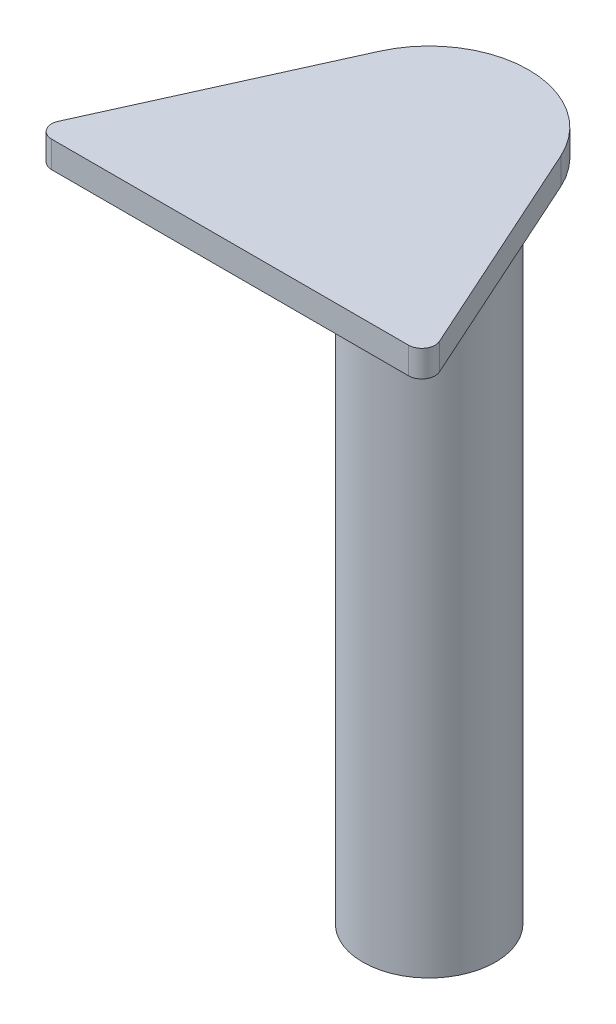
ISO-10303-21;
HEADER;
FILE_DESCRIPTION(('STEP AP214'),'2;1');
FILE_NAME('part.step','',(''),(''),'','','');
FILE_SCHEMA(('AUTOMOTIVE_DESIGN { 1 0 10303 214 1 1 1 1 }'));
ENDSEC;
DATA;
#1=APPLICATION_CONTEXT('core data for automotive mechanical design processes');
#2=APPLICATION_PROTOCOL_DEFINITION('international standard','automotive_design',2000,#1);
#3=PRODUCT_CONTEXT('',#1,'mechanical');
#4=PRODUCT('Part','Part','',(#3));
#5=PRODUCT_RELATED_PRODUCT_CATEGORY('part','',(#4));
#6=PRODUCT_DEFINITION_FORMATION('','',#4);
#7=PRODUCT_DEFINITION_CONTEXT('part definition',#1,'design');
#8=PRODUCT_DEFINITION('design','',#6,#7);
#9=PRODUCT_DEFINITION_SHAPE('','',#8);
#10=(LENGTH_UNIT() NAMED_UNIT(*) SI_UNIT(.MILLI.,.METRE.));
#11=(NAMED_UNIT(*) PLANE_ANGLE_UNIT() SI_UNIT($,.RADIAN.));
#12=(NAMED_UNIT(*) SI_UNIT($,.STERADIAN.) SOLID_ANGLE_UNIT());
#13=UNCERTAINTY_MEASURE_WITH_UNIT(LENGTH_MEASURE(1.E-05),#10,'distance_accuracy_value','');
#14=(GEOMETRIC_REPRESENTATION_CONTEXT(3) GLOBAL_UNCERTAINTY_ASSIGNED_CONTEXT((#13)) GLOBAL_UNIT_ASSIGNED_CONTEXT((#10,
#11,#12)) REPRESENTATION_CONTEXT('',''));
#15=CARTESIAN_POINT('',(0.,0.,0.));
#16=DIRECTION('',(0.,0.,1.));
#17=DIRECTION('',(1.,0.,0.));
#18=AXIS2_PLACEMENT_3D('',#15,#16,#17);
#19=CARTESIAN_POINT('',(0.,50.,0.));
#20=DIRECTION('',(0.,-1.,0.));
#21=DIRECTION('',(0.,0.,-1.));
#22=AXIS2_PLACEMENT_3D('',#19,#20,#21);
#23=CYLINDRICAL_SURFACE('',#22,5.);
#24=CARTESIAN_POINT('',(0.,50.,0.));
#25=DIRECTION('',(0.,1.,0.));
#26=DIRECTION('',(0.,0.,1.));
#27=AXIS2_PLACEMENT_3D('',#24,#25,#26);
#28=CIRCLE('',#27,5.);
#29=CARTESIAN_POINT('',(0.,50.,5.));
#30=VERTEX_POINT('',#29);
#31=EDGE_CURVE('E11',#30,#30,#28,.T.);
#32=ORIENTED_EDGE('',*,*,#31,.F.);
#33=EDGE_LOOP('',(#32));
#34=FACE_BOUND('',#33,.T.);
#35=CARTESIAN_POINT('',(0.,0.,0.));
#36=DIRECTION('',(0.,1.,0.));
#37=DIRECTION('',(0.,0.,1.));
#38=AXIS2_PLACEMENT_3D('',#35,#36,#37);
#39=CIRCLE('',#38,5.);
#40=CARTESIAN_POINT('',(0.,0.,5.));
#41=VERTEX_POINT('',#40);
#42=EDGE_CURVE('E48',#41,#41,#39,.T.);
#43=ORIENTED_EDGE('',*,*,#42,.T.);
#44=EDGE_LOOP('',(#43));
#45=FACE_BOUND('',#44,.T.);
#46=ADVANCED_FACE('F44',(#34,#45),#23,.T.);
#47=CARTESIAN_POINT('',(0.,0.,0.));
#48=DIRECTION('',(0.,1.,0.));
#49=DIRECTION('',(0.,0.,1.));
#50=AXIS2_PLACEMENT_3D('',#47,#48,#49);
#51=PLANE('',#50);
#52=ORIENTED_EDGE('',*,*,#42,.F.);
#53=EDGE_LOOP('',(#52));
#54=FACE_BOUND('',#53,.T.);
#55=ADVANCED_FACE('F168',(#54),#51,.F.);
#56=CARTESIAN_POINT('',(13.4514162296451,52.,14.));
#57=DIRECTION('',(0.,-1.,0.));
#58=DIRECTION('',(0.,0.,-1.));
#59=AXIS2_PLACEMENT_3D('',#56,#57,#58);
#60=CYLINDRICAL_SURFACE('',#59,1.);
#61=CARTESIAN_POINT('',(13.4514162296451,50.,14.));
#62=DIRECTION('',(0.,1.,0.));
#63=DIRECTION('',(0.,0.,1.));
#64=AXIS2_PLACEMENT_3D('',#61,#62,#63);
#65=CIRCLE('',#64,1.);
#66=CARTESIAN_POINT('',(13.4514162296451,50.,15.));
#67=VERTEX_POINT('',#66);
#68=CARTESIAN_POINT('',(14.3628540574113,50.,13.5885621722338));
#69=VERTEX_POINT('',#68);
#70=EDGE_CURVE('E133',#67,#69,#65,.T.);
#71=ORIENTED_EDGE('',*,*,#70,.T.);
#72=DIRECTION('',(0.,-1.,0.));
#73=VECTOR('',#72,1.);
#74=CARTESIAN_POINT('',(14.3628540574113,52.,13.5885621722338));
#75=LINE('',#74,#73);
#76=CARTESIAN_POINT('',(14.3628540574113,52.,13.5885621722338));
#77=VERTEX_POINT('',#76);
#78=EDGE_CURVE('E165',#77,#69,#75,.T.);
#79=ORIENTED_EDGE('',*,*,#78,.F.);
#80=CARTESIAN_POINT('',(13.4514162296451,52.,14.));
#81=DIRECTION('',(0.,1.,0.));
#82=DIRECTION('',(0.,0.,1.));
#83=AXIS2_PLACEMENT_3D('',#80,#81,#82);
#84=CIRCLE('',#83,1.);
#85=CARTESIAN_POINT('',(13.4514162296451,52.,15.));
#86=VERTEX_POINT('',#85);
#87=EDGE_CURVE('E151',#86,#77,#84,.T.);
#88=ORIENTED_EDGE('',*,*,#87,.F.);
#89=DIRECTION('',(0.,-1.,0.));
#90=VECTOR('',#89,1.);
#91=CARTESIAN_POINT('',(13.4514162296451,52.,15.));
#92=LINE('',#91,#90);
#93=EDGE_CURVE('E132',#86,#67,#92,.T.);
#94=ORIENTED_EDGE('',*,*,#93,.T.);
#95=EDGE_LOOP('',(#71,#79,#88,#94));
#96=FACE_BOUND('',#95,.T.);
#97=ADVANCED_FACE('F175',(#96),#60,.T.);
#98=CARTESIAN_POINT('',(14.3628540574113,52.,13.5885621722338));
#99=DIRECTION('',(-0.911437827766148,0.,0.411437827766148));
#100=DIRECTION('',(0.411437827766148,0.,0.911437827766148));
#101=AXIS2_PLACEMENT_3D('',#98,#99,#100);
#102=PLANE('',#101);
#103=DIRECTION('',(-0.411437827766148,0.,-0.911437827766148));
#104=VECTOR('',#103,1.);
#105=CARTESIAN_POINT('',(14.3628540574113,50.,13.5885621722338));
#106=LINE('',#105,#104);
#107=CARTESIAN_POINT('',(6.83578370824611,50.,-3.08578370824611));
#108=VERTEX_POINT('',#107);
#109=EDGE_CURVE('E136',#69,#108,#106,.T.);
#110=ORIENTED_EDGE('',*,*,#109,.T.);
#111=DIRECTION('',(0.,-1.,0.));
#112=VECTOR('',#111,1.);
#113=CARTESIAN_POINT('',(6.83578370824611,52.,-3.08578370824611));
#114=LINE('',#113,#112);
#115=CARTESIAN_POINT('',(6.83578370824611,52.,-3.08578370824611));
#116=VERTEX_POINT('',#115);
#117=EDGE_CURVE('E158',#116,#108,#114,.T.);
#118=ORIENTED_EDGE('',*,*,#117,.F.);
#119=DIRECTION('',(-0.411437827766148,0.,-0.911437827766148));
#120=VECTOR('',#119,1.);
#121=CARTESIAN_POINT('',(14.3628540574113,52.,13.5885621722338));
#122=LINE('',#121,#120);
#123=EDGE_CURVE('E99',#77,#116,#122,.T.);
#124=ORIENTED_EDGE('',*,*,#123,.F.);
#125=ORIENTED_EDGE('',*,*,#78,.T.);
#126=EDGE_LOOP('',(#110,#118,#124,#125));
#127=FACE_BOUND('',#126,.T.);
#128=ADVANCED_FACE('F180',(#127),#102,.F.);
#129=CARTESIAN_POINT('',(0.,52.,0.));
#130=DIRECTION('',(0.,-1.,0.));
#131=DIRECTION('',(0.,0.,-1.));
#132=AXIS2_PLACEMENT_3D('',#129,#130,#131);
#133=CYLINDRICAL_SURFACE('',#132,7.5);
#134=CARTESIAN_POINT('',(0.,50.,0.));
#135=DIRECTION('',(0.,1.,0.));
#136=DIRECTION('',(0.,0.,1.));
#137=AXIS2_PLACEMENT_3D('',#134,#135,#136);
#138=CIRCLE('',#137,7.5);
#139=CARTESIAN_POINT('',(-6.83578370824611,50.,-3.08578370824611));
#140=VERTEX_POINT('',#139);
#141=EDGE_CURVE('E142',#108,#140,#138,.T.);
#142=ORIENTED_EDGE('',*,*,#141,.T.);
#143=DIRECTION('',(0.,-1.,0.));
#144=VECTOR('',#143,1.);
#145=CARTESIAN_POINT('',(-6.83578370824611,52.,-3.08578370824611));
#146=LINE('',#145,#144);
#147=CARTESIAN_POINT('',(-6.83578370824611,52.,-3.08578370824611));
#148=VERTEX_POINT('',#147);
#149=EDGE_CURVE('E121',#148,#140,#146,.T.);
#150=ORIENTED_EDGE('',*,*,#149,.F.);
#151=CARTESIAN_POINT('',(0.,52.,0.));
#152=DIRECTION('',(0.,1.,0.));
#153=DIRECTION('',(0.,0.,1.));
#154=AXIS2_PLACEMENT_3D('',#151,#152,#153);
#155=CIRCLE('',#154,7.5);
#156=EDGE_CURVE('E114',#116,#148,#155,.T.);
#157=ORIENTED_EDGE('',*,*,#156,.F.);
#158=ORIENTED_EDGE('',*,*,#117,.T.);
#159=EDGE_LOOP('',(#142,#150,#157,#158));
#160=FACE_BOUND('',#159,.T.);
#161=ADVANCED_FACE('F184',(#160),#133,.T.);
#162=CARTESIAN_POINT('',(-14.3628540574113,52.,13.5885621722338));
#163=DIRECTION('',(0.911437827766148,0.,0.411437827766148));
#164=DIRECTION('',(0.411437827766148,0.,-0.911437827766148));
#165=AXIS2_PLACEMENT_3D('',#162,#163,#164);
#166=PLANE('',#165);
#167=DIRECTION('',(-0.411437827766148,0.,0.911437827766148));
#168=VECTOR('',#167,1.);
#169=CARTESIAN_POINT('',(-14.3628540574113,50.,13.5885621722338));
#170=LINE('',#169,#168);
#171=CARTESIAN_POINT('',(-14.3628540574113,50.,13.5885621722338));
#172=VERTEX_POINT('',#171);
#173=EDGE_CURVE('E125',#140,#172,#170,.T.);
#174=ORIENTED_EDGE('',*,*,#173,.T.);
#175=DIRECTION('',(0.,-1.,0.));
#176=VECTOR('',#175,1.);
#177=CARTESIAN_POINT('',(-14.3628540574113,52.,13.5885621722338));
#178=LINE('',#177,#176);
#179=CARTESIAN_POINT('',(-14.3628540574113,52.,13.5885621722338));
#180=VERTEX_POINT('',#179);
#181=EDGE_CURVE('E116',#180,#172,#178,.T.);
#182=ORIENTED_EDGE('',*,*,#181,.F.);
#183=DIRECTION('',(-0.411437827766148,0.,0.911437827766148));
#184=VECTOR('',#183,1.);
#185=CARTESIAN_POINT('',(-14.3628540574113,52.,13.5885621722338));
#186=LINE('',#185,#184);
#187=EDGE_CURVE('E110',#148,#180,#186,.T.);
#188=ORIENTED_EDGE('',*,*,#187,.F.);
#189=ORIENTED_EDGE('',*,*,#149,.T.);
#190=EDGE_LOOP('',(#174,#182,#188,#189));
#191=FACE_BOUND('',#190,.T.);
#192=ADVANCED_FACE('F118',(#191),#166,.F.);
#193=CARTESIAN_POINT('',(-13.4514162296451,52.,14.));
#194=DIRECTION('',(0.,-1.,0.));
#195=DIRECTION('',(0.,0.,-1.));
#196=AXIS2_PLACEMENT_3D('',#193,#194,#195);
#197=CYLINDRICAL_SURFACE('',#196,1.);
#198=CARTESIAN_POINT('',(-13.4514162296451,50.,14.));
#199=DIRECTION('',(0.,1.,0.));
#200=DIRECTION('',(0.,0.,-1.));
#201=AXIS2_PLACEMENT_3D('',#198,#199,#200);
#202=CIRCLE('',#201,1.);
#203=CARTESIAN_POINT('',(-13.4514162296451,50.,15.));
#204=VERTEX_POINT('',#203);
#205=EDGE_CURVE('E83',#172,#204,#202,.T.);
#206=ORIENTED_EDGE('',*,*,#205,.T.);
#207=DIRECTION('',(0.,-1.,0.));
#208=VECTOR('',#207,1.);
#209=CARTESIAN_POINT('',(-13.4514162296451,52.,15.));
#210=LINE('',#209,#208);
#211=CARTESIAN_POINT('',(-13.4514162296451,52.,15.));
#212=VERTEX_POINT('',#211);
#213=EDGE_CURVE('E123',#212,#204,#210,.T.);
#214=ORIENTED_EDGE('',*,*,#213,.F.);
#215=CARTESIAN_POINT('',(-13.4514162296451,52.,14.));
#216=DIRECTION('',(0.,1.,0.));
#217=DIRECTION('',(0.,0.,-1.));
#218=AXIS2_PLACEMENT_3D('',#215,#216,#217);
#219=CIRCLE('',#218,1.);
#220=EDGE_CURVE('E112',#180,#212,#219,.T.);
#221=ORIENTED_EDGE('',*,*,#220,.F.);
#222=ORIENTED_EDGE('',*,*,#181,.T.);
#223=EDGE_LOOP('',(#206,#214,#221,#222));
#224=FACE_BOUND('',#223,.T.);
#225=ADVANCED_FACE('F130',(#224),#197,.T.);
#226=CARTESIAN_POINT('',(-13.4514162296451,52.,15.));
#227=DIRECTION('',(0.,0.,-1.));
#228=DIRECTION('',(-1.,0.,0.));
#229=AXIS2_PLACEMENT_3D('',#226,#227,#228);
#230=PLANE('',#229);
#231=DIRECTION('',(1.,0.,0.));
#232=VECTOR('',#231,1.);
#233=CARTESIAN_POINT('',(-13.4514162296451,50.,15.));
#234=LINE('',#233,#232);
#235=EDGE_CURVE('E93',#204,#67,#234,.T.);
#236=ORIENTED_EDGE('',*,*,#235,.T.);
#237=ORIENTED_EDGE('',*,*,#93,.F.);
#238=DIRECTION('',(1.,0.,0.));
#239=VECTOR('',#238,1.);
#240=CARTESIAN_POINT('',(-13.4514162296451,52.,15.));
#241=LINE('',#240,#239);
#242=EDGE_CURVE('E65',#212,#86,#241,.T.);
#243=ORIENTED_EDGE('',*,*,#242,.F.);
#244=ORIENTED_EDGE('',*,*,#213,.T.);
#245=EDGE_LOOP('',(#236,#237,#243,#244));
#246=FACE_BOUND('',#245,.T.);
#247=ADVANCED_FACE('F195',(#246),#230,.F.);
#248=CARTESIAN_POINT('',(13.4514162296451,52.,14.));
#249=DIRECTION('',(0.,1.,0.));
#250=DIRECTION('',(0.,0.,1.));
#251=AXIS2_PLACEMENT_3D('',#248,#249,#250);
#252=PLANE('',#251);
#253=ORIENTED_EDGE('',*,*,#87,.T.);
#254=ORIENTED_EDGE('',*,*,#123,.T.);
#255=ORIENTED_EDGE('',*,*,#156,.T.);
#256=ORIENTED_EDGE('',*,*,#187,.T.);
#257=ORIENTED_EDGE('',*,*,#220,.T.);
#258=ORIENTED_EDGE('',*,*,#242,.T.);
#259=EDGE_LOOP('',(#253,#254,#255,#256,#257,#258));
#260=FACE_BOUND('',#259,.T.);
#261=ADVANCED_FACE('F108',(#260),#252,.T.);
#262=CARTESIAN_POINT('',(13.4514162296451,50.,14.));
#263=DIRECTION('',(0.,1.,0.));
#264=DIRECTION('',(0.,0.,1.));
#265=AXIS2_PLACEMENT_3D('',#262,#263,#264);
#266=PLANE('',#265);
#267=ORIENTED_EDGE('',*,*,#31,.T.);
#268=EDGE_LOOP('',(#267));
#269=FACE_BOUND('',#268,.T.);
#270=ORIENTED_EDGE('',*,*,#70,.F.);
#271=ORIENTED_EDGE('',*,*,#235,.F.);
#272=ORIENTED_EDGE('',*,*,#205,.F.);
#273=ORIENTED_EDGE('',*,*,#173,.F.);
#274=ORIENTED_EDGE('',*,*,#141,.F.);
#275=ORIENTED_EDGE('',*,*,#109,.F.);
#276=EDGE_LOOP('',(#270,#271,#272,#273,#274,#275));
#277=FACE_BOUND('',#276,.T.);
#278=ADVANCED_FACE('F193',(#269,#277),#266,.F.);
#279=CLOSED_SHELL('',(#46,#55,#97,#128,#161,#192,#225,#247,#261,#278));
#280=MANIFOLD_SOLID_BREP('B2',#279);
#281=ADVANCED_BREP_SHAPE_REPRESENTATION('',(#18,#280),#14);
#282=SHAPE_DEFINITION_REPRESENTATION(#9,#281);
ENDSEC;
END-ISO-10303-21;
